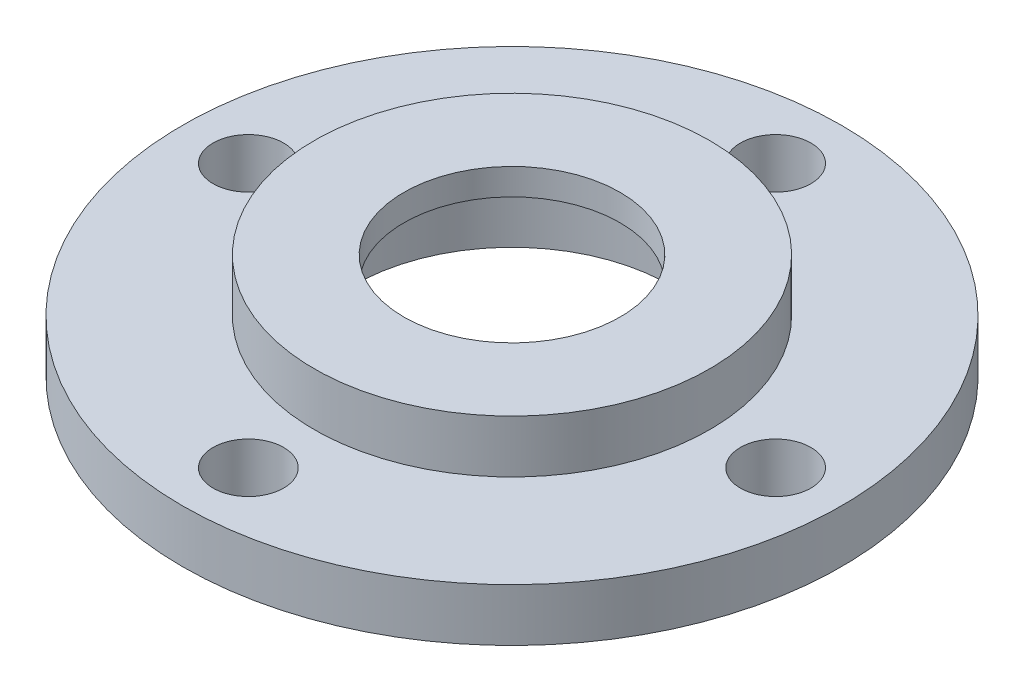
ISO-10303-21;
HEADER;
FILE_DESCRIPTION(('STEP AP214'),'2;1');
FILE_NAME('part.step','',(''),(''),'','','');
FILE_SCHEMA(('AUTOMOTIVE_DESIGN { 1 0 10303 214 1 1 1 1 }'));
ENDSEC;
DATA;
#1=APPLICATION_CONTEXT('core data for automotive mechanical design processes');
#2=APPLICATION_PROTOCOL_DEFINITION('international standard','automotive_design',2000,#1);
#3=PRODUCT_CONTEXT('',#1,'mechanical');
#4=PRODUCT('Part','Part','',(#3));
#5=PRODUCT_RELATED_PRODUCT_CATEGORY('part','',(#4));
#6=PRODUCT_DEFINITION_FORMATION('','',#4);
#7=PRODUCT_DEFINITION_CONTEXT('part definition',#1,'design');
#8=PRODUCT_DEFINITION('design','',#6,#7);
#9=PRODUCT_DEFINITION_SHAPE('','',#8);
#10=(LENGTH_UNIT() NAMED_UNIT(*) SI_UNIT(.MILLI.,.METRE.));
#11=(NAMED_UNIT(*) PLANE_ANGLE_UNIT() SI_UNIT($,.RADIAN.));
#12=(NAMED_UNIT(*) SI_UNIT($,.STERADIAN.) SOLID_ANGLE_UNIT());
#13=UNCERTAINTY_MEASURE_WITH_UNIT(LENGTH_MEASURE(1.E-05),#10,'distance_accuracy_value','');
#14=(GEOMETRIC_REPRESENTATION_CONTEXT(3) GLOBAL_UNCERTAINTY_ASSIGNED_CONTEXT((#13)) GLOBAL_UNIT_ASSIGNED_CONTEXT((#10,
#11,#12)) REPRESENTATION_CONTEXT('',''));
#15=CARTESIAN_POINT('',(0.,0.,0.));
#16=DIRECTION('',(0.,0.,1.));
#17=DIRECTION('',(1.,0.,0.));
#18=AXIS2_PLACEMENT_3D('',#15,#16,#17);
#19=CARTESIAN_POINT('',(0.,2.54,0.));
#20=DIRECTION('',(0.,-1.,0.));
#21=DIRECTION('',(0.,0.,1.));
#22=AXIS2_PLACEMENT_3D('',#19,#20,#21);
#23=CYLINDRICAL_SURFACE('',#22,15.875);
#24=CARTESIAN_POINT('',(0.,2.54,0.));
#25=DIRECTION('',(0.,-1.,0.));
#26=DIRECTION('',(0.,0.,-1.));
#27=AXIS2_PLACEMENT_3D('',#24,#25,#26);
#28=CIRCLE('',#27,15.875);
#29=CARTESIAN_POINT('',(0.,2.54,-15.875));
#30=VERTEX_POINT('',#29);
#31=EDGE_CURVE('E46',#30,#30,#28,.T.);
#32=ORIENTED_EDGE('',*,*,#31,.T.);
#33=EDGE_LOOP('',(#32));
#34=FACE_BOUND('',#33,.T.);
#35=CARTESIAN_POINT('',(0.,0.,0.));
#36=DIRECTION('',(0.,-1.,0.));
#37=DIRECTION('',(0.,0.,-1.));
#38=AXIS2_PLACEMENT_3D('',#35,#36,#37);
#39=CIRCLE('',#38,15.875);
#40=CARTESIAN_POINT('',(0.,0.,-15.875));
#41=VERTEX_POINT('',#40);
#42=EDGE_CURVE('E42',#41,#41,#39,.T.);
#43=ORIENTED_EDGE('',*,*,#42,.F.);
#44=EDGE_LOOP('',(#43));
#45=FACE_BOUND('',#44,.T.);
#46=ADVANCED_FACE('F39',(#34,#45),#23,.T.);
#47=CARTESIAN_POINT('',(0.,2.54,0.));
#48=DIRECTION('',(0.,1.,0.));
#49=DIRECTION('',(0.,0.,-1.));
#50=AXIS2_PLACEMENT_3D('',#47,#48,#49);
#51=PLANE('',#50);
#52=CARTESIAN_POINT('',(0.,2.54,12.7));
#53=DIRECTION('',(0.,-1.,0.));
#54=DIRECTION('',(0.,0.,-1.));
#55=AXIS2_PLACEMENT_3D('',#52,#53,#54);
#56=CIRCLE('',#55,1.7);
#57=CARTESIAN_POINT('',(0.,2.54,11.));
#58=VERTEX_POINT('',#57);
#59=EDGE_CURVE('E84',#58,#58,#56,.T.);
#60=ORIENTED_EDGE('',*,*,#59,.T.);
#61=EDGE_LOOP('',(#60));
#62=FACE_BOUND('',#61,.T.);
#63=CARTESIAN_POINT('',(12.7,2.54,0.));
#64=DIRECTION('',(0.,-1.,0.));
#65=DIRECTION('',(0.,0.,-1.));
#66=AXIS2_PLACEMENT_3D('',#63,#64,#65);
#67=CIRCLE('',#66,1.70000000000004);
#68=CARTESIAN_POINT('',(12.7,2.54,-1.70000000000004));
#69=VERTEX_POINT('',#68);
#70=EDGE_CURVE('E81',#69,#69,#67,.T.);
#71=ORIENTED_EDGE('',*,*,#70,.T.);
#72=EDGE_LOOP('',(#71));
#73=FACE_BOUND('',#72,.T.);
#74=CARTESIAN_POINT('',(0.,2.54,-12.7));
#75=DIRECTION('',(0.,-1.,0.));
#76=DIRECTION('',(0.,0.,-1.));
#77=AXIS2_PLACEMENT_3D('',#74,#75,#76);
#78=CIRCLE('',#77,1.7);
#79=CARTESIAN_POINT('',(0.,2.54,-14.4));
#80=VERTEX_POINT('',#79);
#81=EDGE_CURVE('E75',#80,#80,#78,.T.);
#82=ORIENTED_EDGE('',*,*,#81,.T.);
#83=EDGE_LOOP('',(#82));
#84=FACE_BOUND('',#83,.T.);
#85=CARTESIAN_POINT('',(-12.7,2.54,0.));
#86=DIRECTION('',(0.,-1.,0.));
#87=DIRECTION('',(0.,0.,-1.));
#88=AXIS2_PLACEMENT_3D('',#85,#86,#87);
#89=CIRCLE('',#88,1.7);
#90=CARTESIAN_POINT('',(-12.7,2.54,-1.7));
#91=VERTEX_POINT('',#90);
#92=EDGE_CURVE('E68',#91,#91,#89,.T.);
#93=ORIENTED_EDGE('',*,*,#92,.T.);
#94=EDGE_LOOP('',(#93));
#95=FACE_BOUND('',#94,.T.);
#96=CARTESIAN_POINT('',(0.,2.54,0.));
#97=DIRECTION('',(0.,-1.,0.));
#98=DIRECTION('',(0.,0.,-1.));
#99=AXIS2_PLACEMENT_3D('',#96,#97,#98);
#100=CIRCLE('',#99,9.525);
#101=CARTESIAN_POINT('',(0.,2.54,-9.525));
#102=VERTEX_POINT('',#101);
#103=EDGE_CURVE('E10',#102,#102,#100,.T.);
#104=ORIENTED_EDGE('',*,*,#103,.T.);
#105=EDGE_LOOP('',(#104));
#106=FACE_BOUND('',#105,.T.);
#107=ORIENTED_EDGE('',*,*,#31,.F.);
#108=EDGE_LOOP('',(#107));
#109=FACE_BOUND('',#108,.T.);
#110=ADVANCED_FACE('F92',(#62,#73,#84,#95,#106,#109),#51,.T.);
#111=CARTESIAN_POINT('',(0.,0.,0.));
#112=DIRECTION('',(0.,1.,0.));
#113=DIRECTION('',(0.,0.,-1.));
#114=AXIS2_PLACEMENT_3D('',#111,#112,#113);
#115=PLANE('',#114);
#116=CARTESIAN_POINT('',(0.,0.,12.7));
#117=DIRECTION('',(0.,-1.,0.));
#118=DIRECTION('',(0.,0.,-1.));
#119=AXIS2_PLACEMENT_3D('',#116,#117,#118);
#120=CIRCLE('',#119,1.7);
#121=CARTESIAN_POINT('',(0.,0.,11.));
#122=VERTEX_POINT('',#121);
#123=EDGE_CURVE('E65',#122,#122,#120,.F.);
#124=ORIENTED_EDGE('',*,*,#123,.T.);
#125=EDGE_LOOP('',(#124));
#126=FACE_BOUND('',#125,.T.);
#127=CARTESIAN_POINT('',(12.7,0.,0.));
#128=DIRECTION('',(0.,-1.,0.));
#129=DIRECTION('',(0.,0.,-1.));
#130=AXIS2_PLACEMENT_3D('',#127,#128,#129);
#131=CIRCLE('',#130,1.70000000000004);
#132=CARTESIAN_POINT('',(12.7,0.,-1.70000000000004));
#133=VERTEX_POINT('',#132);
#134=EDGE_CURVE('E78',#133,#133,#131,.F.);
#135=ORIENTED_EDGE('',*,*,#134,.T.);
#136=EDGE_LOOP('',(#135));
#137=FACE_BOUND('',#136,.T.);
#138=CARTESIAN_POINT('',(0.,0.,-12.7));
#139=DIRECTION('',(0.,-1.,0.));
#140=DIRECTION('',(0.,0.,-1.));
#141=AXIS2_PLACEMENT_3D('',#138,#139,#140);
#142=CIRCLE('',#141,1.7);
#143=CARTESIAN_POINT('',(0.,0.,-14.4));
#144=VERTEX_POINT('',#143);
#145=EDGE_CURVE('E71',#144,#144,#142,.F.);
#146=ORIENTED_EDGE('',*,*,#145,.T.);
#147=EDGE_LOOP('',(#146));
#148=FACE_BOUND('',#147,.T.);
#149=CARTESIAN_POINT('',(-12.7,0.,0.));
#150=DIRECTION('',(0.,-1.,0.));
#151=DIRECTION('',(0.,0.,-1.));
#152=AXIS2_PLACEMENT_3D('',#149,#150,#151);
#153=CIRCLE('',#152,1.7);
#154=CARTESIAN_POINT('',(-12.7,0.,-1.7));
#155=VERTEX_POINT('',#154);
#156=EDGE_CURVE('E72',#155,#155,#153,.F.);
#157=ORIENTED_EDGE('',*,*,#156,.T.);
#158=EDGE_LOOP('',(#157));
#159=FACE_BOUND('',#158,.T.);
#160=CARTESIAN_POINT('',(0.,0.,0.));
#161=DIRECTION('',(0.,1.,0.));
#162=DIRECTION('',(0.,0.,1.));
#163=AXIS2_PLACEMENT_3D('',#160,#161,#162);
#164=CIRCLE('',#163,7.62);
#165=CARTESIAN_POINT('',(0.,0.,7.62));
#166=VERTEX_POINT('',#165);
#167=EDGE_CURVE('E56',#166,#166,#164,.T.);
#168=ORIENTED_EDGE('',*,*,#167,.T.);
#169=EDGE_LOOP('',(#168));
#170=FACE_BOUND('',#169,.T.);
#171=ORIENTED_EDGE('',*,*,#42,.T.);
#172=EDGE_LOOP('',(#171));
#173=FACE_BOUND('',#172,.T.);
#174=ADVANCED_FACE('F102',(#126,#137,#148,#159,#170,#173),#115,.F.);
#175=CARTESIAN_POINT('',(0.,5.08,0.));
#176=DIRECTION('',(0.,-1.,0.));
#177=DIRECTION('',(0.,0.,1.));
#178=AXIS2_PLACEMENT_3D('',#175,#176,#177);
#179=CYLINDRICAL_SURFACE('',#178,9.525);
#180=CARTESIAN_POINT('',(0.,5.08,0.));
#181=DIRECTION('',(0.,-1.,0.));
#182=DIRECTION('',(0.,0.,-1.));
#183=AXIS2_PLACEMENT_3D('',#180,#181,#182);
#184=CIRCLE('',#183,9.525);
#185=CARTESIAN_POINT('',(0.,5.08,-9.525));
#186=VERTEX_POINT('',#185);
#187=EDGE_CURVE('E52',#186,#186,#184,.T.);
#188=ORIENTED_EDGE('',*,*,#187,.T.);
#189=EDGE_LOOP('',(#188));
#190=FACE_BOUND('',#189,.T.);
#191=ORIENTED_EDGE('',*,*,#103,.F.);
#192=EDGE_LOOP('',(#191));
#193=FACE_BOUND('',#192,.T.);
#194=ADVANCED_FACE('F105',(#190,#193),#179,.T.);
#195=CARTESIAN_POINT('',(0.,5.08,0.));
#196=DIRECTION('',(0.,1.,0.));
#197=DIRECTION('',(0.,0.,-1.));
#198=AXIS2_PLACEMENT_3D('',#195,#196,#197);
#199=PLANE('',#198);
#200=CARTESIAN_POINT('',(0.,5.08,0.));
#201=DIRECTION('',(0.,-1.,0.));
#202=DIRECTION('',(0.,0.,-1.));
#203=AXIS2_PLACEMENT_3D('',#200,#201,#202);
#204=CIRCLE('',#203,5.207);
#205=CARTESIAN_POINT('',(0.,5.08,-5.207));
#206=VERTEX_POINT('',#205);
#207=EDGE_CURVE('E59',#206,#206,#204,.T.);
#208=ORIENTED_EDGE('',*,*,#207,.T.);
#209=EDGE_LOOP('',(#208));
#210=FACE_BOUND('',#209,.T.);
#211=ORIENTED_EDGE('',*,*,#187,.F.);
#212=EDGE_LOOP('',(#211));
#213=FACE_BOUND('',#212,.T.);
#214=ADVANCED_FACE('F130',(#210,#213),#199,.T.);
#215=CARTESIAN_POINT('',(0.,3.81,0.));
#216=DIRECTION('',(0.,-1.,0.));
#217=DIRECTION('',(0.,0.,1.));
#218=AXIS2_PLACEMENT_3D('',#215,#216,#217);
#219=CYLINDRICAL_SURFACE('',#218,7.62);
#220=CARTESIAN_POINT('',(0.,3.81,0.));
#221=DIRECTION('',(0.,1.,0.));
#222=DIRECTION('',(0.,0.,1.));
#223=AXIS2_PLACEMENT_3D('',#220,#221,#222);
#224=CIRCLE('',#223,7.62);
#225=CARTESIAN_POINT('',(0.,3.81,7.62));
#226=VERTEX_POINT('',#225);
#227=EDGE_CURVE('E55',#226,#226,#224,.T.);
#228=CARTESIAN_POINT('',(0.,3.81,7.62));
#229=CARTESIAN_POINT('',(0.,3.7703125,7.62));
#230=CARTESIAN_POINT('',(0.,3.730625,7.62));
#231=CARTESIAN_POINT('',(0.,3.65125,7.62));
#232=CARTESIAN_POINT('',(0.,3.6115625,7.62));
#233=CARTESIAN_POINT('',(0.,3.5321875,7.62));
#234=CARTESIAN_POINT('',(0.,3.4925,7.62));
#235=CARTESIAN_POINT('',(0.,3.413125,7.62));
#236=CARTESIAN_POINT('',(0.,3.3734375,7.62));
#237=CARTESIAN_POINT('',(0.,3.2940625,7.62));
#238=CARTESIAN_POINT('',(0.,3.254375,7.62));
#239=CARTESIAN_POINT('',(0.,3.175,7.62));
#240=CARTESIAN_POINT('',(0.,3.1353125,7.62));
#241=CARTESIAN_POINT('',(0.,3.0559375,7.62));
#242=CARTESIAN_POINT('',(0.,3.01625,7.62));
#243=CARTESIAN_POINT('',(0.,2.936875,7.62));
#244=CARTESIAN_POINT('',(0.,2.8971875,7.62));
#245=CARTESIAN_POINT('',(0.,2.8178125,7.62));
#246=CARTESIAN_POINT('',(0.,2.778125,7.62));
#247=CARTESIAN_POINT('',(0.,2.69875,7.62));
#248=CARTESIAN_POINT('',(0.,2.6590625,7.62));
#249=CARTESIAN_POINT('',(0.,2.5796875,7.62));
#250=CARTESIAN_POINT('',(0.,2.54,7.62));
#251=CARTESIAN_POINT('',(0.,2.460625,7.62));
#252=CARTESIAN_POINT('',(0.,2.4209375,7.62));
#253=CARTESIAN_POINT('',(0.,2.3415625,7.62));
#254=CARTESIAN_POINT('',(0.,2.301875,7.62));
#255=CARTESIAN_POINT('',(0.,2.2225,7.62));
#256=CARTESIAN_POINT('',(0.,2.1828125,7.62));
#257=CARTESIAN_POINT('',(0.,2.1034375,7.62));
#258=CARTESIAN_POINT('',(0.,2.06375,7.62));
#259=CARTESIAN_POINT('',(0.,1.984375,7.62));
#260=CARTESIAN_POINT('',(0.,1.9446875,7.62));
#261=CARTESIAN_POINT('',(0.,1.8653125,7.62));
#262=CARTESIAN_POINT('',(0.,1.825625,7.62));
#263=CARTESIAN_POINT('',(0.,1.74625,7.62));
#264=CARTESIAN_POINT('',(0.,1.7065625,7.62));
#265=CARTESIAN_POINT('',(0.,1.6271875,7.62));
#266=CARTESIAN_POINT('',(0.,1.5875,7.62));
#267=CARTESIAN_POINT('',(0.,1.508125,7.62));
#268=CARTESIAN_POINT('',(0.,1.4684375,7.62));
#269=CARTESIAN_POINT('',(0.,1.3890625,7.62));
#270=CARTESIAN_POINT('',(0.,1.349375,7.62));
#271=CARTESIAN_POINT('',(0.,1.27,7.62));
#272=CARTESIAN_POINT('',(0.,1.2303125,7.62));
#273=CARTESIAN_POINT('',(0.,1.1509375,7.62));
#274=CARTESIAN_POINT('',(0.,1.11125,7.62));
#275=CARTESIAN_POINT('',(0.,1.031875,7.62));
#276=CARTESIAN_POINT('',(0.,0.9921875,7.62));
#277=CARTESIAN_POINT('',(0.,0.9128125,7.62));
#278=CARTESIAN_POINT('',(0.,0.873125,7.62));
#279=CARTESIAN_POINT('',(0.,0.79375,7.62));
#280=CARTESIAN_POINT('',(0.,0.7540625,7.62));
#281=CARTESIAN_POINT('',(0.,0.6746875,7.62));
#282=CARTESIAN_POINT('',(0.,0.635,7.62));
#283=CARTESIAN_POINT('',(0.,0.555625,7.62));
#284=CARTESIAN_POINT('',(0.,0.5159375,7.62));
#285=CARTESIAN_POINT('',(0.,0.4365625,7.62));
#286=CARTESIAN_POINT('',(0.,0.396875,7.62));
#287=CARTESIAN_POINT('',(0.,0.3175,7.62));
#288=CARTESIAN_POINT('',(0.,0.2778125,7.62));
#289=CARTESIAN_POINT('',(0.,0.1984375,7.62));
#290=CARTESIAN_POINT('',(0.,0.15875,7.62));
#291=CARTESIAN_POINT('',(0.,0.0793749999999999,7.62));
#292=CARTESIAN_POINT('',(0.,0.0396874999999999,7.62));
#293=CARTESIAN_POINT('',(0.,0.,7.62));
#294=B_SPLINE_CURVE_WITH_KNOTS('',3,(#228,#229,#230,#231,#232,#233,#234,#235,#236,#237,#238,
#239,#240,#241,#242,#243,#244,#245,#246,#247,#248,#249,#250,#251,#252,#253,#254,#255,#256,#257,
#258,#259,#260,#261,#262,#263,#264,#265,#266,#267,#268,#269,#270,#271,#272,#273,#274,#275,#276,
#277,#278,#279,#280,#281,#282,#283,#284,#285,#286,#287,#288,#289,#290,#291,#292,#293),
.UNSPECIFIED.,.F.,.F.,(4,2,2,2,2,2,2,2,2,2,2,2,2,2,2,2,2,2,2,2,2,2,2,2,2,2,2,2,2,2,2,2,4),(0.,
0.1190625,0.238125,0.3571875,0.47625,0.5953125,0.714375,0.8334375,0.9525,1.0715625,1.190625,
1.3096875,1.42875,1.5478125,1.666875,1.7859375,1.905,2.0240625,2.143125,2.2621875,2.38125,
2.5003125,2.619375,2.7384375,2.8575,2.9765625,3.095625,3.2146875,3.33375,3.4528125,3.571875,
3.6909375,3.81),.UNSPECIFIED.);
#295=EDGE_CURVE('BSEAM134',#226,#166,#294,.T.);
#296=ORIENTED_EDGE('',*,*,#227,.T.);
#297=ORIENTED_EDGE('',*,*,#167,.F.);
#298=ORIENTED_EDGE('',*,*,#295,.T.);
#299=ORIENTED_EDGE('',*,*,#295,.F.);
#300=EDGE_LOOP('',(#296,#298,#297,#299));
#301=FACE_BOUND('',#300,.T.);
#302=ADVANCED_FACE('F134',(#301),#219,.F.);
#303=CARTESIAN_POINT('',(0.,3.81,0.));
#304=DIRECTION('',(0.,-1.,0.));
#305=DIRECTION('',(0.,0.,1.));
#306=AXIS2_PLACEMENT_3D('',#303,#304,#305);
#307=PLANE('',#306);
#308=CARTESIAN_POINT('',(0.,3.81,0.));
#309=DIRECTION('',(0.,1.,0.));
#310=DIRECTION('',(0.,0.,1.));
#311=AXIS2_PLACEMENT_3D('',#308,#309,#310);
#312=CIRCLE('',#311,5.207);
#313=CARTESIAN_POINT('',(0.,3.81,5.207));
#314=VERTEX_POINT('',#313);
#315=EDGE_CURVE('E62',#314,#314,#312,.F.);
#316=ORIENTED_EDGE('',*,*,#315,.F.);
#317=EDGE_LOOP('',(#316));
#318=FACE_BOUND('',#317,.T.);
#319=ORIENTED_EDGE('',*,*,#227,.F.);
#320=EDGE_LOOP('',(#319));
#321=FACE_BOUND('',#320,.T.);
#322=ADVANCED_FACE('F138',(#318,#321),#307,.T.);
#323=CARTESIAN_POINT('',(0.,-0.00100000000000013,0.));
#324=DIRECTION('',(0.,1.,0.));
#325=DIRECTION('',(0.,0.,-1.));
#326=AXIS2_PLACEMENT_3D('',#323,#324,#325);
#327=CYLINDRICAL_SURFACE('',#326,5.207);
#328=ORIENTED_EDGE('',*,*,#315,.T.);
#329=EDGE_LOOP('',(#328));
#330=FACE_BOUND('',#329,.T.);
#331=ORIENTED_EDGE('',*,*,#207,.F.);
#332=EDGE_LOOP('',(#331));
#333=FACE_BOUND('',#332,.T.);
#334=ADVANCED_FACE('F142',(#330,#333),#327,.F.);
#335=CARTESIAN_POINT('',(-12.7,-0.00100000000000013,0.));
#336=DIRECTION('',(0.,1.,0.));
#337=DIRECTION('',(0.,0.,-1.));
#338=AXIS2_PLACEMENT_3D('',#335,#336,#337);
#339=CYLINDRICAL_SURFACE('',#338,1.7);
#340=ORIENTED_EDGE('',*,*,#92,.F.);
#341=EDGE_LOOP('',(#340));
#342=FACE_BOUND('',#341,.T.);
#343=ORIENTED_EDGE('',*,*,#156,.F.);
#344=EDGE_LOOP('',(#343));
#345=FACE_BOUND('',#344,.T.);
#346=ADVANCED_FACE('F146',(#342,#345),#339,.F.);
#347=CARTESIAN_POINT('',(0.,-0.00100000000000013,-12.7));
#348=DIRECTION('',(0.,1.,0.));
#349=DIRECTION('',(0.,0.,-1.));
#350=AXIS2_PLACEMENT_3D('',#347,#348,#349);
#351=CYLINDRICAL_SURFACE('',#350,1.7);
#352=ORIENTED_EDGE('',*,*,#81,.F.);
#353=EDGE_LOOP('',(#352));
#354=FACE_BOUND('',#353,.T.);
#355=ORIENTED_EDGE('',*,*,#145,.F.);
#356=EDGE_LOOP('',(#355));
#357=FACE_BOUND('',#356,.T.);
#358=ADVANCED_FACE('F150',(#354,#357),#351,.F.);
#359=CARTESIAN_POINT('',(12.7,-0.00100000000000013,0.));
#360=DIRECTION('',(0.,1.,0.));
#361=DIRECTION('',(0.,0.,-1.));
#362=AXIS2_PLACEMENT_3D('',#359,#360,#361);
#363=CYLINDRICAL_SURFACE('',#362,1.70000000000004);
#364=ORIENTED_EDGE('',*,*,#70,.F.);
#365=EDGE_LOOP('',(#364));
#366=FACE_BOUND('',#365,.T.);
#367=ORIENTED_EDGE('',*,*,#134,.F.);
#368=EDGE_LOOP('',(#367));
#369=FACE_BOUND('',#368,.T.);
#370=ADVANCED_FACE('F98',(#366,#369),#363,.F.);
#371=CARTESIAN_POINT('',(0.,-0.00100000000000013,12.7));
#372=DIRECTION('',(0.,1.,0.));
#373=DIRECTION('',(0.,0.,-1.));
#374=AXIS2_PLACEMENT_3D('',#371,#372,#373);
#375=CYLINDRICAL_SURFACE('',#374,1.7);
#376=ORIENTED_EDGE('',*,*,#59,.F.);
#377=EDGE_LOOP('',(#376));
#378=FACE_BOUND('',#377,.T.);
#379=ORIENTED_EDGE('',*,*,#123,.F.);
#380=EDGE_LOOP('',(#379));
#381=FACE_BOUND('',#380,.T.);
#382=ADVANCED_FACE('F95',(#378,#381),#375,.F.);
#383=CLOSED_SHELL('',(#46,#110,#174,#194,#214,#302,#322,#334,#346,#358,#370,#382));
#384=MANIFOLD_SOLID_BREP('B2',#383);
#385=ADVANCED_BREP_SHAPE_REPRESENTATION('',(#18,#384),#14);
#386=SHAPE_DEFINITION_REPRESENTATION(#9,#385);
ENDSEC;
END-ISO-10303-21;
